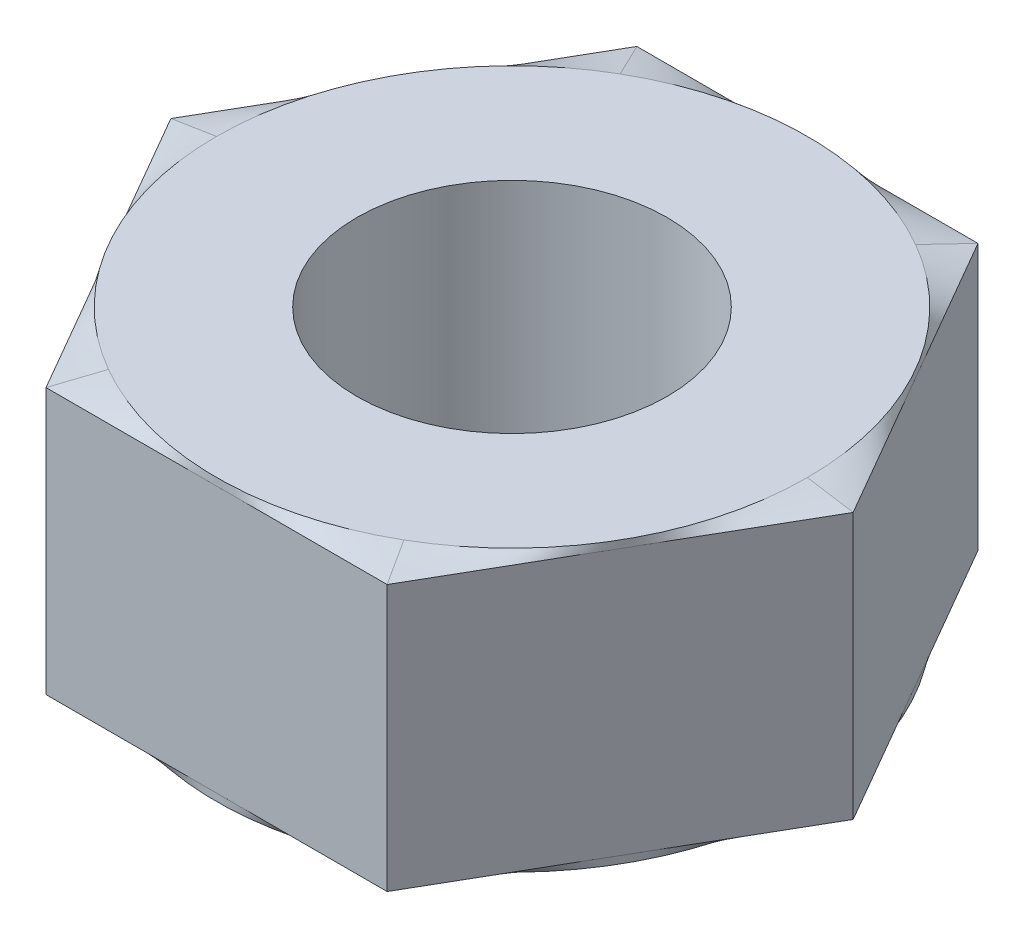
ISO-10303-21;
HEADER;
FILE_DESCRIPTION(('STEP AP214'),'2;1');
FILE_NAME('part.step','',(''),(''),'','','');
FILE_SCHEMA(('AUTOMOTIVE_DESIGN { 1 0 10303 214 1 1 1 1 }'));
ENDSEC;
DATA;
#1=APPLICATION_CONTEXT('core data for automotive mechanical design processes');
#2=APPLICATION_PROTOCOL_DEFINITION('international standard','automotive_design',2000,#1);
#3=PRODUCT_CONTEXT('',#1,'mechanical');
#4=PRODUCT('Part','Part','',(#3));
#5=PRODUCT_RELATED_PRODUCT_CATEGORY('part','',(#4));
#6=PRODUCT_DEFINITION_FORMATION('','',#4);
#7=PRODUCT_DEFINITION_CONTEXT('part definition',#1,'design');
#8=PRODUCT_DEFINITION('design','',#6,#7);
#9=PRODUCT_DEFINITION_SHAPE('','',#8);
#10=(LENGTH_UNIT() NAMED_UNIT(*) SI_UNIT(.MILLI.,.METRE.));
#11=(NAMED_UNIT(*) PLANE_ANGLE_UNIT() SI_UNIT($,.RADIAN.));
#12=(NAMED_UNIT(*) SI_UNIT($,.STERADIAN.) SOLID_ANGLE_UNIT());
#13=UNCERTAINTY_MEASURE_WITH_UNIT(LENGTH_MEASURE(1.E-05),#10,'distance_accuracy_value','');
#14=(GEOMETRIC_REPRESENTATION_CONTEXT(3) GLOBAL_UNCERTAINTY_ASSIGNED_CONTEXT((#13)) GLOBAL_UNIT_ASSIGNED_CONTEXT((#10,
#11,#12)) REPRESENTATION_CONTEXT('',''));
#15=CARTESIAN_POINT('',(0.,0.,0.));
#16=DIRECTION('',(0.,0.,1.));
#17=DIRECTION('',(1.,0.,0.));
#18=AXIS2_PLACEMENT_3D('',#15,#16,#17);
#19=CARTESIAN_POINT('',(2.3094010767585,1.8,4.));
#20=DIRECTION('',(-0.866025403784439,0.,-0.5));
#21=DIRECTION('',(-0.5,0.,0.866025403784439));
#22=AXIS2_PLACEMENT_3D('',#19,#20,#21);
#23=PLANE('',#22);
#24=DIRECTION('',(-0.5,0.,0.866025403784439));
#25=VECTOR('',#24,1.);
#26=CARTESIAN_POINT('',(2.3094010767585,0.,4.));
#27=LINE('',#26,#25);
#28=CARTESIAN_POINT('',(2.3094010767585,0.,4.));
#29=VERTEX_POINT('',#28);
#30=CARTESIAN_POINT('',(4.618802153517,0.,0.));
#31=VERTEX_POINT('',#30);
#32=EDGE_CURVE('E161',#29,#31,#27,.F.);
#33=ORIENTED_EDGE('',*,*,#32,.T.);
#34=DIRECTION('',(0.,-1.,0.));
#35=VECTOR('',#34,1.);
#36=CARTESIAN_POINT('',(4.618802153517,1.8,0.));
#37=LINE('',#36,#35);
#38=CARTESIAN_POINT('',(4.618802153517,3.6,0.));
#39=VERTEX_POINT('',#38);
#40=EDGE_CURVE('E12',#39,#31,#37,.T.);
#41=ORIENTED_EDGE('',*,*,#40,.F.);
#42=CARTESIAN_POINT('',(2.3094010767585,3.6,4.));
#43=CARTESIAN_POINT('',(2.50185116648838,3.6,3.66666666666666));
#44=CARTESIAN_POINT('',(2.69430125621826,3.6,3.33333333333333));
#45=CARTESIAN_POINT('',(3.07920143567801,3.6,2.66666666666666));
#46=CARTESIAN_POINT('',(3.27165152540788,3.6,2.33333333333333));
#47=CARTESIAN_POINT('',(3.65655170486763,3.6,1.66666666666666));
#48=CARTESIAN_POINT('',(3.84900179459751,3.6,1.33333333333333));
#49=CARTESIAN_POINT('',(4.23390197405726,3.6,0.666666666666661));
#50=CARTESIAN_POINT('',(4.42635206378713,3.6,0.33333333333333));
#51=CARTESIAN_POINT('',(4.618802153517,3.6,0.));
#52=B_SPLINE_CURVE_WITH_KNOTS('',3,(#42,#43,#44,#45,#46,#47,#48,#49,#50,#51),.UNSPECIFIED.,.F.,
.F.,(4,2,2,2,4),(0.,0.25,0.5,0.75,1.),.UNSPECIFIED.);
#53=CARTESIAN_POINT('',(2.3094010767585,3.6,4.));
#54=VERTEX_POINT('',#53);
#55=EDGE_CURVE('E238',#54,#39,#52,.T.);
#56=ORIENTED_EDGE('',*,*,#55,.F.);
#57=DIRECTION('',(0.,-1.,0.));
#58=VECTOR('',#57,1.);
#59=CARTESIAN_POINT('',(2.3094010767585,1.8,4.));
#60=LINE('',#59,#58);
#61=EDGE_CURVE('E521',#54,#29,#60,.T.);
#62=ORIENTED_EDGE('',*,*,#61,.T.);
#63=EDGE_LOOP('',(#33,#41,#56,#62));
#64=FACE_BOUND('',#63,.T.);
#65=ADVANCED_FACE('F123',(#64),#23,.F.);
#66=CARTESIAN_POINT('',(4.618802153517,1.8,0.));
#67=DIRECTION('',(-0.866025403784438,0.,0.5));
#68=DIRECTION('',(0.5,0.,0.866025403784439));
#69=AXIS2_PLACEMENT_3D('',#66,#67,#68);
#70=PLANE('',#69);
#71=DIRECTION('',(0.5,0.,0.866025403784439));
#72=VECTOR('',#71,1.);
#73=CARTESIAN_POINT('',(4.618802153517,0.,0.));
#74=LINE('',#73,#72);
#75=CARTESIAN_POINT('',(2.3094010767585,0.,-4.));
#76=VERTEX_POINT('',#75);
#77=EDGE_CURVE('E167',#31,#76,#74,.F.);
#78=ORIENTED_EDGE('',*,*,#77,.T.);
#79=DIRECTION('',(0.,-1.,0.));
#80=VECTOR('',#79,1.);
#81=CARTESIAN_POINT('',(2.3094010767585,1.8,-4.));
#82=LINE('',#81,#80);
#83=CARTESIAN_POINT('',(2.3094010767585,3.6,-4.));
#84=VERTEX_POINT('',#83);
#85=EDGE_CURVE('E133',#84,#76,#82,.T.);
#86=ORIENTED_EDGE('',*,*,#85,.F.);
#87=CARTESIAN_POINT('',(4.61880215351701,3.6,0.));
#88=CARTESIAN_POINT('',(4.52257710865207,3.6,-0.166666666666667));
#89=CARTESIAN_POINT('',(4.42635206378713,3.6,-0.333333333333333));
#90=CARTESIAN_POINT('',(4.23390197405726,3.6,-0.666666666666665));
#91=CARTESIAN_POINT('',(4.13767692919232,3.6,-0.833333333333331));
#92=CARTESIAN_POINT('',(3.94522683946244,3.6,-1.16666666666666));
#93=CARTESIAN_POINT('',(3.84900179459751,3.6,-1.33333333333333));
#94=CARTESIAN_POINT('',(3.65655170486763,3.6,-1.66666666666666));
#95=CARTESIAN_POINT('',(3.56032666000269,3.6,-1.83333333333333));
#96=CARTESIAN_POINT('',(3.36787657027282,3.6,-2.16666666666666));
#97=CARTESIAN_POINT('',(3.27165152540788,3.6,-2.33333333333333));
#98=CARTESIAN_POINT('',(3.079201435678,3.6,-2.66666666666666));
#99=CARTESIAN_POINT('',(2.98297639081307,3.6,-2.83333333333333));
#100=CARTESIAN_POINT('',(2.79052630108319,3.6,-3.16666666666666));
#101=CARTESIAN_POINT('',(2.69430125621825,3.6,-3.33333333333333));
#102=CARTESIAN_POINT('',(2.50185116648838,3.6,-3.66666666666667));
#103=CARTESIAN_POINT('',(2.40562612162344,3.6,-3.83333333333333));
#104=CARTESIAN_POINT('',(2.3094010767585,3.6,-4.));
#105=B_SPLINE_CURVE_WITH_KNOTS('',3,(#87,#88,#89,#90,#91,#92,#93,#94,#95,#96,#97,#98,#99,#100,
#101,#102,#103,#104),.UNSPECIFIED.,.F.,.F.,(4,2,2,2,2,2,2,2,4),(0.,0.577350269189624,
1.15470053837925,1.73205080756887,2.3094010767585,2.88675134594812,3.46410161513775,
4.04145188432738,4.61880215351701),.UNSPECIFIED.);
#106=EDGE_CURVE('E689',#39,#84,#105,.T.);
#107=ORIENTED_EDGE('',*,*,#106,.F.);
#108=ORIENTED_EDGE('',*,*,#40,.T.);
#109=EDGE_LOOP('',(#78,#86,#107,#108));
#110=FACE_BOUND('',#109,.T.);
#111=ADVANCED_FACE('F511',(#110),#70,.F.);
#112=CARTESIAN_POINT('',(2.3094010767585,1.8,-4.));
#113=DIRECTION('',(0.,0.,1.));
#114=DIRECTION('',(1.,0.,0.));
#115=AXIS2_PLACEMENT_3D('',#112,#113,#114);
#116=PLANE('',#115);
#117=DIRECTION('',(1.,0.,0.));
#118=VECTOR('',#117,1.);
#119=CARTESIAN_POINT('',(2.3094010767585,0.,-4.));
#120=LINE('',#119,#118);
#121=CARTESIAN_POINT('',(-2.3094010767585,0.,-4.));
#122=VERTEX_POINT('',#121);
#123=EDGE_CURVE('E142',#76,#122,#120,.F.);
#124=ORIENTED_EDGE('',*,*,#123,.T.);
#125=DIRECTION('',(0.,-1.,0.));
#126=VECTOR('',#125,1.);
#127=CARTESIAN_POINT('',(-2.3094010767585,1.8,-4.));
#128=LINE('',#127,#126);
#129=CARTESIAN_POINT('',(-2.3094010767585,3.6,-4.));
#130=VERTEX_POINT('',#129);
#131=EDGE_CURVE('E578',#130,#122,#128,.T.);
#132=ORIENTED_EDGE('',*,*,#131,.F.);
#133=CARTESIAN_POINT('',(2.3094010767585,3.6,-4.));
#134=CARTESIAN_POINT('',(2.11695098702863,3.6,-4.));
#135=CARTESIAN_POINT('',(1.92450089729875,3.6,-4.));
#136=CARTESIAN_POINT('',(1.539600717839,3.6,-4.));
#137=CARTESIAN_POINT('',(1.34715062810912,3.6,-4.));
#138=CARTESIAN_POINT('',(0.962250448649373,3.6,-4.));
#139=CARTESIAN_POINT('',(0.769800358919498,3.6,-4.));
#140=CARTESIAN_POINT('',(0.384900179459747,3.6,-4.));
#141=CARTESIAN_POINT('',(0.192450089729872,3.6,-4.));
#142=CARTESIAN_POINT('',(-0.192450089729879,3.6,-4.));
#143=CARTESIAN_POINT('',(-0.384900179459754,3.6,-4.));
#144=CARTESIAN_POINT('',(-0.769800358919504,3.6,-4.));
#145=CARTESIAN_POINT('',(-0.96225044864938,3.6,-4.));
#146=CARTESIAN_POINT('',(-1.34715062810913,3.6,-4.));
#147=CARTESIAN_POINT('',(-1.53960071783901,3.6,-4.));
#148=CARTESIAN_POINT('',(-1.92450089729876,3.6,-4.));
#149=CARTESIAN_POINT('',(-2.11695098702863,3.6,-4.));
#150=CARTESIAN_POINT('',(-2.30940107675851,3.6,-4.));
#151=B_SPLINE_CURVE_WITH_KNOTS('',3,(#133,#134,#135,#136,#137,#138,#139,#140,#141,#142,#143,
#144,#145,#146,#147,#148,#149,#150),.UNSPECIFIED.,.F.,.F.,(4,2,2,2,2,2,2,2,4),(0.,
0.577350269189627,1.15470053837925,1.73205080756888,2.3094010767585,2.88675134594813,
3.46410161513776,4.04145188432738,4.61880215351701),.UNSPECIFIED.);
#152=EDGE_CURVE('E599',#84,#130,#151,.T.);
#153=ORIENTED_EDGE('',*,*,#152,.F.);
#154=ORIENTED_EDGE('',*,*,#85,.T.);
#155=EDGE_LOOP('',(#124,#132,#153,#154));
#156=FACE_BOUND('',#155,.T.);
#157=ADVANCED_FACE('F516',(#156),#116,.F.);
#158=CARTESIAN_POINT('',(-2.3094010767585,1.8,-4.));
#159=DIRECTION('',(0.866025403784439,0.,0.5));
#160=DIRECTION('',(0.5,0.,-0.866025403784439));
#161=AXIS2_PLACEMENT_3D('',#158,#159,#160);
#162=PLANE('',#161);
#163=DIRECTION('',(0.5,0.,-0.866025403784439));
#164=VECTOR('',#163,1.);
#165=CARTESIAN_POINT('',(-2.3094010767585,0.,-4.));
#166=LINE('',#165,#164);
#167=CARTESIAN_POINT('',(-4.61880215351701,0.,0.));
#168=VERTEX_POINT('',#167);
#169=EDGE_CURVE('E637',#122,#168,#166,.F.);
#170=ORIENTED_EDGE('',*,*,#169,.T.);
#171=DIRECTION('',(0.,-1.,0.));
#172=VECTOR('',#171,1.);
#173=CARTESIAN_POINT('',(-4.61880215351701,1.8,0.));
#174=LINE('',#173,#172);
#175=CARTESIAN_POINT('',(-4.61880215351701,3.6,0.));
#176=VERTEX_POINT('',#175);
#177=EDGE_CURVE('E570',#176,#168,#174,.T.);
#178=ORIENTED_EDGE('',*,*,#177,.F.);
#179=CARTESIAN_POINT('',(-2.3094010767585,3.6,-4.));
#180=CARTESIAN_POINT('',(-2.40562612162344,3.6,-3.83333333333334));
#181=CARTESIAN_POINT('',(-2.50185116648838,3.6,-3.66666666666667));
#182=CARTESIAN_POINT('',(-2.69430125621825,3.6,-3.33333333333333));
#183=CARTESIAN_POINT('',(-2.79052630108319,3.6,-3.16666666666667));
#184=CARTESIAN_POINT('',(-2.98297639081307,3.6,-2.83333333333333));
#185=CARTESIAN_POINT('',(-3.07920143567801,3.6,-2.66666666666667));
#186=CARTESIAN_POINT('',(-3.27165152540788,3.6,-2.33333333333333));
#187=CARTESIAN_POINT('',(-3.36787657027282,3.6,-2.16666666666667));
#188=CARTESIAN_POINT('',(-3.56032666000269,3.6,-1.83333333333333));
#189=CARTESIAN_POINT('',(-3.65655170486763,3.6,-1.66666666666667));
#190=CARTESIAN_POINT('',(-3.84900179459751,3.6,-1.33333333333333));
#191=CARTESIAN_POINT('',(-3.94522683946244,3.6,-1.16666666666667));
#192=CARTESIAN_POINT('',(-4.13767692919232,3.6,-0.833333333333333));
#193=CARTESIAN_POINT('',(-4.23390197405726,3.6,-0.666666666666667));
#194=CARTESIAN_POINT('',(-4.42635206378713,3.6,-0.333333333333333));
#195=CARTESIAN_POINT('',(-4.52257710865207,3.6,-0.166666666666666));
#196=CARTESIAN_POINT('',(-4.61880215351701,3.6,0.));
#197=B_SPLINE_CURVE_WITH_KNOTS('',3,(#179,#180,#181,#182,#183,#184,#185,#186,#187,#188,#189,
#190,#191,#192,#193,#194,#195,#196),.UNSPECIFIED.,.F.,.F.,(4,2,2,2,2,2,2,2,4),(0.,
0.577350269189626,1.15470053837925,1.73205080756888,2.3094010767585,2.88675134594813,
3.46410161513776,4.04145188432738,4.61880215351701),.UNSPECIFIED.);
#198=EDGE_CURVE('E396',#130,#176,#197,.T.);
#199=ORIENTED_EDGE('',*,*,#198,.F.);
#200=ORIENTED_EDGE('',*,*,#131,.T.);
#201=EDGE_LOOP('',(#170,#178,#199,#200));
#202=FACE_BOUND('',#201,.T.);
#203=ADVANCED_FACE('F561',(#202),#162,.F.);
#204=CARTESIAN_POINT('',(-4.61880215351701,1.8,0.));
#205=DIRECTION('',(0.866025403784439,0.,-0.5));
#206=DIRECTION('',(-0.5,0.,-0.866025403784439));
#207=AXIS2_PLACEMENT_3D('',#204,#205,#206);
#208=PLANE('',#207);
#209=DIRECTION('',(-0.5,0.,-0.866025403784439));
#210=VECTOR('',#209,1.);
#211=CARTESIAN_POINT('',(-4.61880215351701,0.,0.));
#212=LINE('',#211,#210);
#213=CARTESIAN_POINT('',(-2.3094010767585,0.,4.));
#214=VERTEX_POINT('',#213);
#215=EDGE_CURVE('E635',#168,#214,#212,.F.);
#216=ORIENTED_EDGE('',*,*,#215,.T.);
#217=DIRECTION('',(0.,-1.,0.));
#218=VECTOR('',#217,1.);
#219=CARTESIAN_POINT('',(-2.3094010767585,1.8,4.));
#220=LINE('',#219,#218);
#221=CARTESIAN_POINT('',(-2.3094010767585,3.6,4.));
#222=VERTEX_POINT('',#221);
#223=EDGE_CURVE('E532',#222,#214,#220,.T.);
#224=ORIENTED_EDGE('',*,*,#223,.F.);
#225=CARTESIAN_POINT('',(-4.61880215351701,3.6,0.));
#226=CARTESIAN_POINT('',(-4.52257710865207,3.6,0.166666666666666));
#227=CARTESIAN_POINT('',(-4.42635206378713,3.6,0.333333333333333));
#228=CARTESIAN_POINT('',(-4.23390197405726,3.6,0.666666666666666));
#229=CARTESIAN_POINT('',(-4.13767692919232,3.6,0.833333333333333));
#230=CARTESIAN_POINT('',(-3.94522683946245,3.6,1.16666666666667));
#231=CARTESIAN_POINT('',(-3.84900179459751,3.6,1.33333333333333));
#232=CARTESIAN_POINT('',(-3.65655170486763,3.6,1.66666666666667));
#233=CARTESIAN_POINT('',(-3.56032666000269,3.6,1.83333333333333));
#234=CARTESIAN_POINT('',(-3.36787657027282,3.6,2.16666666666667));
#235=CARTESIAN_POINT('',(-3.27165152540788,3.6,2.33333333333333));
#236=CARTESIAN_POINT('',(-3.07920143567801,3.6,2.66666666666667));
#237=CARTESIAN_POINT('',(-2.98297639081307,3.6,2.83333333333333));
#238=CARTESIAN_POINT('',(-2.79052630108319,3.6,3.16666666666667));
#239=CARTESIAN_POINT('',(-2.69430125621825,3.6,3.33333333333333));
#240=CARTESIAN_POINT('',(-2.50185116648838,3.6,3.66666666666667));
#241=CARTESIAN_POINT('',(-2.40562612162344,3.6,3.83333333333334));
#242=CARTESIAN_POINT('',(-2.3094010767585,3.6,4.));
#243=B_SPLINE_CURVE_WITH_KNOTS('',3,(#225,#226,#227,#228,#229,#230,#231,#232,#233,#234,#235,
#236,#237,#238,#239,#240,#241,#242),.UNSPECIFIED.,.F.,.F.,(4,2,2,2,2,2,2,2,4),(0.,
0.577350269189626,1.15470053837925,1.73205080756888,2.3094010767585,2.88675134594813,
3.46410161513776,4.04145188432738,4.61880215351701),.UNSPECIFIED.);
#244=EDGE_CURVE('E407',#176,#222,#243,.T.);
#245=ORIENTED_EDGE('',*,*,#244,.F.);
#246=ORIENTED_EDGE('',*,*,#177,.T.);
#247=EDGE_LOOP('',(#216,#224,#245,#246));
#248=FACE_BOUND('',#247,.T.);
#249=ADVANCED_FACE('F553',(#248),#208,.F.);
#250=CARTESIAN_POINT('',(-2.3094010767585,1.8,4.));
#251=DIRECTION('',(0.,0.,-1.));
#252=DIRECTION('',(-1.,0.,0.));
#253=AXIS2_PLACEMENT_3D('',#250,#251,#252);
#254=PLANE('',#253);
#255=DIRECTION('',(-1.,0.,0.));
#256=VECTOR('',#255,1.);
#257=CARTESIAN_POINT('',(-2.3094010767585,0.,4.));
#258=LINE('',#257,#256);
#259=EDGE_CURVE('E529',#214,#29,#258,.F.);
#260=ORIENTED_EDGE('',*,*,#259,.T.);
#261=ORIENTED_EDGE('',*,*,#61,.F.);
#262=CARTESIAN_POINT('',(-2.3094010767585,3.6,4.));
#263=CARTESIAN_POINT('',(-2.11695098702863,3.6,4.));
#264=CARTESIAN_POINT('',(-1.92450089729875,3.6,4.));
#265=CARTESIAN_POINT('',(-1.539600717839,3.6,4.));
#266=CARTESIAN_POINT('',(-1.34715062810913,3.6,4.));
#267=CARTESIAN_POINT('',(-0.962250448649378,3.6,4.));
#268=CARTESIAN_POINT('',(-0.769800358919503,3.6,4.));
#269=CARTESIAN_POINT('',(-0.384900179459752,3.6,4.));
#270=CARTESIAN_POINT('',(-0.192450089729877,3.6,4.));
#271=CARTESIAN_POINT('',(0.192450089729873,3.6,4.));
#272=CARTESIAN_POINT('',(0.384900179459749,3.6,4.));
#273=CARTESIAN_POINT('',(0.769800358919499,3.6,4.));
#274=CARTESIAN_POINT('',(0.962250448649375,3.6,4.));
#275=CARTESIAN_POINT('',(1.34715062810913,3.6,4.));
#276=CARTESIAN_POINT('',(1.539600717839,3.6,4.));
#277=CARTESIAN_POINT('',(1.92450089729875,3.6,4.));
#278=CARTESIAN_POINT('',(2.11695098702863,3.6,4.));
#279=CARTESIAN_POINT('',(2.3094010767585,3.6,4.));
#280=B_SPLINE_CURVE_WITH_KNOTS('',3,(#262,#263,#264,#265,#266,#267,#268,#269,#270,#271,#272,
#273,#274,#275,#276,#277,#278,#279),.UNSPECIFIED.,.F.,.F.,(4,2,2,2,2,2,2,2,4),(0.,
0.577350269189625,1.15470053837925,1.73205080756888,2.3094010767585,2.88675134594813,
3.46410161513775,4.04145188432738,4.61880215351701),.UNSPECIFIED.);
#281=EDGE_CURVE('E418',#222,#54,#280,.T.);
#282=ORIENTED_EDGE('',*,*,#281,.F.);
#283=ORIENTED_EDGE('',*,*,#223,.T.);
#284=EDGE_LOOP('',(#260,#261,#282,#283));
#285=FACE_BOUND('',#284,.T.);
#286=ADVANCED_FACE('F543',(#285),#254,.F.);
#287=CARTESIAN_POINT('',(0.,-0.1,0.));
#288=DIRECTION('',(0.,-1.,0.));
#289=DIRECTION('',(0.,0.,-1.));
#290=AXIS2_PLACEMENT_3D('',#287,#288,#289);
#291=PLANE('',#290);
#292=CARTESIAN_POINT('',(0.,-0.1,0.));
#293=DIRECTION('',(0.,1.,0.));
#294=DIRECTION('',(0.,0.,1.));
#295=AXIS2_PLACEMENT_3D('',#292,#293,#294);
#296=CIRCLE('',#295,2.1);
#297=CARTESIAN_POINT('',(0.,-0.1,2.1));
#298=VERTEX_POINT('',#297);
#299=EDGE_CURVE('E322',#298,#298,#296,.T.);
#300=ORIENTED_EDGE('',*,*,#299,.T.);
#301=EDGE_LOOP('',(#300));
#302=FACE_BOUND('',#301,.T.);
#303=CARTESIAN_POINT('',(0.,-0.1,0.));
#304=DIRECTION('',(0.,-1.,0.));
#305=DIRECTION('',(0.,0.,-1.));
#306=AXIS2_PLACEMENT_3D('',#303,#304,#305);
#307=CIRCLE('',#306,4.);
#308=CARTESIAN_POINT('',(4.,-0.1,0.));
#309=VERTEX_POINT('',#308);
#310=CARTESIAN_POINT('',(2.,-0.1,3.46410161513776));
#311=VERTEX_POINT('',#310);
#312=EDGE_CURVE('E174',#309,#311,#307,.T.);
#313=ORIENTED_EDGE('',*,*,#312,.T.);
#314=CARTESIAN_POINT('',(-2.,-0.1,3.46410161513776));
#315=VERTEX_POINT('',#314);
#316=EDGE_CURVE('E179',#311,#315,#307,.T.);
#317=ORIENTED_EDGE('',*,*,#316,.T.);
#318=CARTESIAN_POINT('',(-4.,-0.1,0.));
#319=VERTEX_POINT('',#318);
#320=EDGE_CURVE('E678',#315,#319,#307,.T.);
#321=ORIENTED_EDGE('',*,*,#320,.T.);
#322=CARTESIAN_POINT('',(-2.,-0.1,-3.46410161513776));
#323=VERTEX_POINT('',#322);
#324=EDGE_CURVE('E656',#319,#323,#307,.T.);
#325=ORIENTED_EDGE('',*,*,#324,.T.);
#326=CARTESIAN_POINT('',(2.,-0.1,-3.46410161513776));
#327=VERTEX_POINT('',#326);
#328=EDGE_CURVE('E653',#323,#327,#307,.T.);
#329=ORIENTED_EDGE('',*,*,#328,.T.);
#330=EDGE_CURVE('E652',#327,#309,#307,.T.);
#331=ORIENTED_EDGE('',*,*,#330,.T.);
#332=EDGE_LOOP('',(#313,#317,#321,#325,#329,#331));
#333=FACE_BOUND('',#332,.T.);
#334=ADVANCED_FACE('F452',(#302,#333),#291,.T.);
#335=CARTESIAN_POINT('',(-2.,-0.1,-3.46410161513776));
#336=CARTESIAN_POINT('',(-2.3094010767585,0.,-4.));
#337=CARTESIAN_POINT('',(-2.28867513459481,-0.1,-3.29743494847109));
#338=CARTESIAN_POINT('',(-2.50185116648838,0.,-3.66666666666667));
#339=CARTESIAN_POINT('',(-2.56618919069857,-0.1,-3.08834100997488));
#340=CARTESIAN_POINT('',(-2.69430125621825,0.,-3.33333333333333));
#341=CARTESIAN_POINT('',(-3.06479008625264,-0.1,-2.59427039522837));
#342=CARTESIAN_POINT('',(-3.07920143567801,0.,-2.66666666666667));
#343=CARTESIAN_POINT('',(-3.28546882018367,-0.1,-2.3094010767585));
#344=CARTESIAN_POINT('',(-3.27165152540788,0.,-2.33333333333333));
#345=CARTESIAN_POINT('',(-3.64273441009184,-0.1,-1.6905989232415));
#346=CARTESIAN_POINT('',(-3.65655170486763,0.,-1.66666666666667));
#347=CARTESIAN_POINT('',(-3.77909910967998,-0.1,-1.35705087434731));
#348=CARTESIAN_POINT('',(-3.84900179459751,0.,-1.33333333333333));
#349=CARTESIAN_POINT('',(-3.95767636553682,-0.1,-0.678214525074557));
#350=CARTESIAN_POINT('',(-4.23390197405726,0.,-0.666666666666666));
#351=CARTESIAN_POINT('',(-4.,-0.1,-0.333333333333333));
#352=CARTESIAN_POINT('',(-4.42635206378713,0.,-0.333333333333333));
#353=CARTESIAN_POINT('',(-4.,-0.1,0.));
#354=CARTESIAN_POINT('',(-4.61880215351701,0.,0.));
#355=B_SPLINE_SURFACE_WITH_KNOTS('',3,1,((#335,#336),(#337,#338),(#339,#340),(#341,#342),(#343,
#344),(#345,#346),(#347,#348),(#349,#350),(#351,#352),(#353,#354)),.UNSPECIFIED.,.F.,.F.,.F.,(4,
2,2,2,4),(2,2),(0.,0.25,0.5,0.75,1.),(0.,1.),.UNSPECIFIED.);
#356=DIRECTION('',(-0.987192622714516,0.159532835673524,0.));
#357=VECTOR('',#356,1.);
#358=CARTESIAN_POINT('',(-4.3094010767585,-0.05,0.));
#359=LINE('',#358,#357);
#360=EDGE_CURVE('E738',#319,#168,#359,.T.);
#361=DIRECTION('',(0.49359631135726,-0.159532835673524,0.854933889699356));
#362=VECTOR('',#361,1.);
#363=CARTESIAN_POINT('',(-2.15470053837925,-0.05,-3.73205080756888));
#364=LINE('',#363,#362);
#365=EDGE_CURVE('E743',#122,#323,#364,.T.);
#366=ORIENTED_EDGE('',*,*,#324,.F.);
#367=ORIENTED_EDGE('',*,*,#360,.T.);
#368=ORIENTED_EDGE('',*,*,#169,.F.);
#369=ORIENTED_EDGE('',*,*,#365,.T.);
#370=EDGE_LOOP('',(#366,#367,#368,#369));
#371=FACE_BOUND('',#370,.T.);
#372=ADVANCED_FACE('F701',(#371),#355,.T.);
#373=CARTESIAN_POINT('',(-4.,-0.1,0.));
#374=CARTESIAN_POINT('',(-4.61880215351701,0.,0.));
#375=CARTESIAN_POINT('',(-4.,-0.1,0.333333333333334));
#376=CARTESIAN_POINT('',(-4.42635206378713,0.,0.333333333333333));
#377=CARTESIAN_POINT('',(-3.95767636553682,-0.1,0.678214525074558));
#378=CARTESIAN_POINT('',(-4.23390197405726,0.,0.666666666666666));
#379=CARTESIAN_POINT('',(-3.77909910967998,-0.1,1.35705087434731));
#380=CARTESIAN_POINT('',(-3.84900179459751,0.,1.33333333333333));
#381=CARTESIAN_POINT('',(-3.64273441009184,-0.1,1.6905989232415));
#382=CARTESIAN_POINT('',(-3.65655170486763,0.,1.66666666666667));
#383=CARTESIAN_POINT('',(-3.28546882018367,-0.1,2.30940107675851));
#384=CARTESIAN_POINT('',(-3.27165152540788,0.,2.33333333333333));
#385=CARTESIAN_POINT('',(-3.06479008625264,-0.1,2.59427039522837));
#386=CARTESIAN_POINT('',(-3.07920143567801,0.,2.66666666666667));
#387=CARTESIAN_POINT('',(-2.56618919069857,-0.1,3.08834100997488));
#388=CARTESIAN_POINT('',(-2.69430125621825,0.,3.33333333333333));
#389=CARTESIAN_POINT('',(-2.28867513459481,-0.1,3.29743494847109));
#390=CARTESIAN_POINT('',(-2.50185116648838,0.,3.66666666666667));
#391=CARTESIAN_POINT('',(-2.,-0.1,3.46410161513776));
#392=CARTESIAN_POINT('',(-2.3094010767585,0.,4.));
#393=B_SPLINE_SURFACE_WITH_KNOTS('',3,1,((#373,#374),(#375,#376),(#377,#378),(#379,#380),(#381,
#382),(#383,#384),(#385,#386),(#387,#388),(#389,#390),(#391,#392)),.UNSPECIFIED.,.F.,.F.,.F.,(4,
2,2,2,4),(2,2),(0.,0.25,0.5,0.75,1.),(0.,1.),.UNSPECIFIED.);
#394=DIRECTION('',(-0.49359631135726,0.159532835673524,0.854933889699356));
#395=VECTOR('',#394,1.);
#396=CARTESIAN_POINT('',(-2.15470053837925,-0.05,3.73205080756888));
#397=LINE('',#396,#395);
#398=EDGE_CURVE('E736',#315,#214,#397,.T.);
#399=ORIENTED_EDGE('',*,*,#320,.F.);
#400=ORIENTED_EDGE('',*,*,#398,.T.);
#401=ORIENTED_EDGE('',*,*,#215,.F.);
#402=ORIENTED_EDGE('',*,*,#360,.F.);
#403=EDGE_LOOP('',(#399,#400,#401,#402));
#404=FACE_BOUND('',#403,.T.);
#405=ADVANCED_FACE('F693',(#404),#393,.T.);
#406=CARTESIAN_POINT('',(2.,-0.1,-3.46410161513776));
#407=CARTESIAN_POINT('',(2.3094010767585,0.,-4.));
#408=CARTESIAN_POINT('',(1.71132486540519,-0.1,-3.63076828180442));
#409=CARTESIAN_POINT('',(1.92450089729875,0.,-4.));
#410=CARTESIAN_POINT('',(1.39148717483824,-0.1,-3.76655553504943));
#411=CARTESIAN_POINT('',(1.539600717839,0.,-4.));
#412=CARTESIAN_POINT('',(0.714309023427341,-0.1,-3.95132126957567));
#413=CARTESIAN_POINT('',(0.769800358919496,0.,-4.));
#414=CARTESIAN_POINT('',(0.357265589908163,-0.1,-4.));
#415=CARTESIAN_POINT('',(0.384900179459746,0.,-4.));
#416=CARTESIAN_POINT('',(-0.357265589908164,-0.1,-4.));
#417=CARTESIAN_POINT('',(-0.384900179459754,0.,-4.));
#418=CARTESIAN_POINT('',(-0.714309023427341,-0.1,-3.95132126957567));
#419=CARTESIAN_POINT('',(-0.769800358919504,0.,-4.));
#420=CARTESIAN_POINT('',(-1.39148717483824,-0.1,-3.76655553504943));
#421=CARTESIAN_POINT('',(-1.539600717839,0.,-4.));
#422=CARTESIAN_POINT('',(-1.71132486540519,-0.1,-3.63076828180442));
#423=CARTESIAN_POINT('',(-1.92450089729875,0.,-4.));
#424=CARTESIAN_POINT('',(-2.,-0.1,-3.46410161513776));
#425=CARTESIAN_POINT('',(-2.3094010767585,0.,-4.));
#426=B_SPLINE_SURFACE_WITH_KNOTS('',3,1,((#406,#407),(#408,#409),(#410,#411),(#412,#413),(#414,
#415),(#416,#417),(#418,#419),(#420,#421),(#422,#423),(#424,#425)),.UNSPECIFIED.,.F.,.F.,.F.,(4,
2,2,2,4),(2,2),(0.,0.25,0.5,0.75,1.),(0.,1.),.UNSPECIFIED.);
#427=DIRECTION('',(0.493596311357257,0.159532835673525,-0.854933889699358));
#428=VECTOR('',#427,1.);
#429=CARTESIAN_POINT('',(2.15470053837925,-0.05,-3.73205080756888));
#430=LINE('',#429,#428);
#431=EDGE_CURVE('E522',#327,#76,#430,.T.);
#432=ORIENTED_EDGE('',*,*,#328,.F.);
#433=ORIENTED_EDGE('',*,*,#365,.F.);
#434=ORIENTED_EDGE('',*,*,#123,.F.);
#435=ORIENTED_EDGE('',*,*,#431,.F.);
#436=EDGE_LOOP('',(#432,#433,#434,#435));
#437=FACE_BOUND('',#436,.T.);
#438=ADVANCED_FACE('F690',(#437),#426,.T.);
#439=CARTESIAN_POINT('',(-2.,-0.1,3.46410161513776));
#440=CARTESIAN_POINT('',(-2.3094010767585,0.,4.));
#441=CARTESIAN_POINT('',(-1.71132486540519,-0.1,3.63076828180442));
#442=CARTESIAN_POINT('',(-1.92450089729875,0.,4.));
#443=CARTESIAN_POINT('',(-1.39148717483824,-0.1,3.76655553504943));
#444=CARTESIAN_POINT('',(-1.539600717839,0.,4.));
#445=CARTESIAN_POINT('',(-0.714309023427341,-0.1,3.95132126957567));
#446=CARTESIAN_POINT('',(-0.769800358919503,0.,4.));
#447=CARTESIAN_POINT('',(-0.357265589908163,-0.1,4.));
#448=CARTESIAN_POINT('',(-0.384900179459752,0.,4.));
#449=CARTESIAN_POINT('',(0.357265589908164,-0.1,4.));
#450=CARTESIAN_POINT('',(0.384900179459749,0.,4.));
#451=CARTESIAN_POINT('',(0.714309023427341,-0.1,3.95132126957567));
#452=CARTESIAN_POINT('',(0.7698003589195,0.,4.));
#453=CARTESIAN_POINT('',(1.39148717483825,-0.1,3.76655553504943));
#454=CARTESIAN_POINT('',(1.539600717839,0.,4.));
#455=CARTESIAN_POINT('',(1.71132486540519,-0.1,3.63076828180442));
#456=CARTESIAN_POINT('',(1.92450089729875,0.,4.));
#457=CARTESIAN_POINT('',(2.,-0.1,3.46410161513776));
#458=CARTESIAN_POINT('',(2.3094010767585,0.,4.));
#459=B_SPLINE_SURFACE_WITH_KNOTS('',3,1,((#439,#440),(#441,#442),(#443,#444),(#445,#446),(#447,
#448),(#449,#450),(#451,#452),(#453,#454),(#455,#456),(#457,#458)),.UNSPECIFIED.,.F.,.F.,.F.,(4,
2,2,2,4),(2,2),(0.,0.25,0.5,0.75,1.),(0.,1.),.UNSPECIFIED.);
#460=DIRECTION('',(0.493596311357257,0.159532835673524,0.854933889699358));
#461=VECTOR('',#460,1.);
#462=CARTESIAN_POINT('',(2.15470053837925,-0.05,3.73205080756888));
#463=LINE('',#462,#461);
#464=EDGE_CURVE('E740',#311,#29,#463,.T.);
#465=ORIENTED_EDGE('',*,*,#316,.F.);
#466=ORIENTED_EDGE('',*,*,#464,.T.);
#467=ORIENTED_EDGE('',*,*,#259,.F.);
#468=ORIENTED_EDGE('',*,*,#398,.F.);
#469=EDGE_LOOP('',(#465,#466,#467,#468));
#470=FACE_BOUND('',#469,.T.);
#471=ADVANCED_FACE('F692',(#470),#459,.T.);
#472=CARTESIAN_POINT('',(2.,-0.1,3.46410161513776));
#473=CARTESIAN_POINT('',(2.3094010767585,0.,4.));
#474=CARTESIAN_POINT('',(2.28867513459481,-0.1,3.29743494847109));
#475=CARTESIAN_POINT('',(2.50185116648838,0.,3.66666666666666));
#476=CARTESIAN_POINT('',(2.56618919069857,-0.1,3.08834100997488));
#477=CARTESIAN_POINT('',(2.69430125621826,0.,3.33333333333333));
#478=CARTESIAN_POINT('',(3.06479008625264,-0.1,2.59427039522837));
#479=CARTESIAN_POINT('',(3.07920143567801,0.,2.66666666666666));
#480=CARTESIAN_POINT('',(3.28546882018367,-0.1,2.3094010767585));
#481=CARTESIAN_POINT('',(3.27165152540788,0.,2.33333333333333));
#482=CARTESIAN_POINT('',(3.64273441009184,-0.1,1.6905989232415));
#483=CARTESIAN_POINT('',(3.65655170486763,0.,1.66666666666666));
#484=CARTESIAN_POINT('',(3.77909910967998,-0.1,1.35705087434731));
#485=CARTESIAN_POINT('',(3.84900179459751,0.,1.33333333333333));
#486=CARTESIAN_POINT('',(3.95767636553682,-0.1,0.678214525074556));
#487=CARTESIAN_POINT('',(4.23390197405726,0.,0.666666666666661));
#488=CARTESIAN_POINT('',(4.,-0.1,0.333333333333332));
#489=CARTESIAN_POINT('',(4.42635206378713,0.,0.33333333333333));
#490=CARTESIAN_POINT('',(4.,-0.1,0.));
#491=CARTESIAN_POINT('',(4.618802153517,0.,0.));
#492=B_SPLINE_SURFACE_WITH_KNOTS('',3,1,((#472,#473),(#474,#475),(#476,#477),(#478,#479),(#480,
#481),(#482,#483),(#484,#485),(#486,#487),(#488,#489),(#490,#491)),.UNSPECIFIED.,.F.,.F.,.F.,(4,
2,2,2,4),(2,2),(0.,0.25,0.5,0.75,1.),(0.,1.),.UNSPECIFIED.);
#493=DIRECTION('',(0.987192622714516,0.159532835673525,0.));
#494=VECTOR('',#493,1.);
#495=CARTESIAN_POINT('',(4.3094010767585,-0.05,0.));
#496=LINE('',#495,#494);
#497=EDGE_CURVE('E525',#309,#31,#496,.T.);
#498=ORIENTED_EDGE('',*,*,#312,.F.);
#499=ORIENTED_EDGE('',*,*,#497,.T.);
#500=ORIENTED_EDGE('',*,*,#32,.F.);
#501=ORIENTED_EDGE('',*,*,#464,.F.);
#502=EDGE_LOOP('',(#498,#499,#500,#501));
#503=FACE_BOUND('',#502,.T.);
#504=ADVANCED_FACE('F699',(#503),#492,.T.);
#505=CARTESIAN_POINT('',(4.,-0.1,0.));
#506=CARTESIAN_POINT('',(4.618802153517,0.,0.));
#507=CARTESIAN_POINT('',(4.,-0.1,-0.333333333333335));
#508=CARTESIAN_POINT('',(4.42635206378713,0.,-0.333333333333333));
#509=CARTESIAN_POINT('',(3.95767636553682,-0.1,-0.678214525074558));
#510=CARTESIAN_POINT('',(4.23390197405725,0.,-0.666666666666665));
#511=CARTESIAN_POINT('',(3.77909910967998,-0.1,-1.35705087434731));
#512=CARTESIAN_POINT('',(3.84900179459751,0.,-1.33333333333333));
#513=CARTESIAN_POINT('',(3.64273441009184,-0.1,-1.6905989232415));
#514=CARTESIAN_POINT('',(3.65655170486763,0.,-1.66666666666666));
#515=CARTESIAN_POINT('',(3.28546882018367,-0.1,-2.3094010767585));
#516=CARTESIAN_POINT('',(3.27165152540788,0.,-2.33333333333333));
#517=CARTESIAN_POINT('',(3.06479008625264,-0.1,-2.59427039522837));
#518=CARTESIAN_POINT('',(3.079201435678,0.,-2.66666666666666));
#519=CARTESIAN_POINT('',(2.56618919069857,-0.1,-3.08834100997488));
#520=CARTESIAN_POINT('',(2.69430125621825,0.,-3.33333333333333));
#521=CARTESIAN_POINT('',(2.28867513459481,-0.1,-3.29743494847109));
#522=CARTESIAN_POINT('',(2.50185116648838,0.,-3.66666666666667));
#523=CARTESIAN_POINT('',(2.,-0.1,-3.46410161513776));
#524=CARTESIAN_POINT('',(2.3094010767585,0.,-4.));
#525=B_SPLINE_SURFACE_WITH_KNOTS('',3,1,((#505,#506),(#507,#508),(#509,#510),(#511,#512),(#513,
#514),(#515,#516),(#517,#518),(#519,#520),(#521,#522),(#523,#524)),.UNSPECIFIED.,.F.,.F.,.F.,(4,
2,2,2,4),(2,2),(0.,0.25,0.5,0.75,1.),(0.,1.),.UNSPECIFIED.);
#526=ORIENTED_EDGE('',*,*,#330,.F.);
#527=ORIENTED_EDGE('',*,*,#431,.T.);
#528=ORIENTED_EDGE('',*,*,#77,.F.);
#529=ORIENTED_EDGE('',*,*,#497,.F.);
#530=EDGE_LOOP('',(#526,#527,#528,#529));
#531=FACE_BOUND('',#530,.T.);
#532=ADVANCED_FACE('F282',(#531),#525,.T.);
#533=CARTESIAN_POINT('',(0.,3.7,0.));
#534=DIRECTION('',(0.,1.,0.));
#535=DIRECTION('',(0.,0.,-1.));
#536=AXIS2_PLACEMENT_3D('',#533,#534,#535);
#537=PLANE('',#536);
#538=CARTESIAN_POINT('',(0.,3.7,0.));
#539=DIRECTION('',(0.,1.,0.));
#540=DIRECTION('',(0.,0.,1.));
#541=AXIS2_PLACEMENT_3D('',#538,#539,#540);
#542=CIRCLE('',#541,2.1);
#543=CARTESIAN_POINT('',(0.,3.7,2.1));
#544=VERTEX_POINT('',#543);
#545=EDGE_CURVE('E127',#544,#544,#542,.F.);
#546=ORIENTED_EDGE('',*,*,#545,.T.);
#547=EDGE_LOOP('',(#546));
#548=FACE_BOUND('',#547,.T.);
#549=CARTESIAN_POINT('',(0.,3.7,0.));
#550=DIRECTION('',(0.,-1.,0.));
#551=DIRECTION('',(0.,0.,-1.));
#552=AXIS2_PLACEMENT_3D('',#549,#550,#551);
#553=CIRCLE('',#552,4.);
#554=CARTESIAN_POINT('',(4.,3.7,0.));
#555=VERTEX_POINT('',#554);
#556=CARTESIAN_POINT('',(2.,3.7,3.46410161513776));
#557=VERTEX_POINT('',#556);
#558=EDGE_CURVE('E236',#555,#557,#553,.T.);
#559=ORIENTED_EDGE('',*,*,#558,.F.);
#560=CARTESIAN_POINT('',(2.,3.7,-3.46410161513776));
#561=VERTEX_POINT('',#560);
#562=EDGE_CURVE('E246',#561,#555,#553,.T.);
#563=ORIENTED_EDGE('',*,*,#562,.F.);
#564=CARTESIAN_POINT('',(-2.,3.7,-3.46410161513776));
#565=VERTEX_POINT('',#564);
#566=EDGE_CURVE('E254',#565,#561,#553,.T.);
#567=ORIENTED_EDGE('',*,*,#566,.F.);
#568=CARTESIAN_POINT('',(-4.,3.7,0.));
#569=VERTEX_POINT('',#568);
#570=EDGE_CURVE('E319',#569,#565,#553,.T.);
#571=ORIENTED_EDGE('',*,*,#570,.F.);
#572=CARTESIAN_POINT('',(-2.,3.7,3.46410161513776));
#573=VERTEX_POINT('',#572);
#574=EDGE_CURVE('E328',#573,#569,#553,.T.);
#575=ORIENTED_EDGE('',*,*,#574,.F.);
#576=EDGE_CURVE('E263',#557,#573,#553,.T.);
#577=ORIENTED_EDGE('',*,*,#576,.F.);
#578=EDGE_LOOP('',(#559,#563,#567,#571,#575,#577));
#579=FACE_BOUND('',#578,.T.);
#580=ADVANCED_FACE('F260',(#548,#579),#537,.T.);
#581=CARTESIAN_POINT('',(-2.,3.7,-3.46410161513776));
#582=CARTESIAN_POINT('',(-2.3094010767585,3.6,-4.));
#583=CARTESIAN_POINT('',(-2.28867513459481,3.7,-3.29743494847109));
#584=CARTESIAN_POINT('',(-2.50185116648838,3.6,-3.66666666666667));
#585=CARTESIAN_POINT('',(-2.56618919069857,3.7,-3.08834100997488));
#586=CARTESIAN_POINT('',(-2.69430125621825,3.6,-3.33333333333333));
#587=CARTESIAN_POINT('',(-3.06479008625264,3.7,-2.59427039522837));
#588=CARTESIAN_POINT('',(-3.07920143567801,3.6,-2.66666666666667));
#589=CARTESIAN_POINT('',(-3.28546882018367,3.7,-2.3094010767585));
#590=CARTESIAN_POINT('',(-3.27165152540788,3.6,-2.33333333333333));
#591=CARTESIAN_POINT('',(-3.64273441009184,3.7,-1.6905989232415));
#592=CARTESIAN_POINT('',(-3.65655170486763,3.6,-1.66666666666667));
#593=CARTESIAN_POINT('',(-3.77909910967998,3.7,-1.35705087434731));
#594=CARTESIAN_POINT('',(-3.84900179459751,3.6,-1.33333333333333));
#595=CARTESIAN_POINT('',(-3.95767636553682,3.7,-0.678214525074557));
#596=CARTESIAN_POINT('',(-4.23390197405726,3.6,-0.666666666666666));
#597=CARTESIAN_POINT('',(-4.,3.7,-0.333333333333333));
#598=CARTESIAN_POINT('',(-4.42635206378713,3.6,-0.333333333333333));
#599=CARTESIAN_POINT('',(-4.,3.7,0.));
#600=CARTESIAN_POINT('',(-4.61880215351701,3.6,0.));
#601=B_SPLINE_SURFACE_WITH_KNOTS('',3,1,((#581,#582),(#583,#584),(#585,#586),(#587,#588),(#589,
#590),(#591,#592),(#593,#594),(#595,#596),(#597,#598),(#599,#600)),.UNSPECIFIED.,.F.,.F.,.F.,(4,
2,2,2,4),(2,2),(0.,0.25,0.5,0.75,1.),(0.,1.),.UNSPECIFIED.);
#602=DIRECTION('',(0.49359631135726,0.159532835673524,0.854933889699356));
#603=VECTOR('',#602,1.);
#604=CARTESIAN_POINT('',(-2.15470053837925,3.65,-3.73205080756888));
#605=LINE('',#604,#603);
#606=EDGE_CURVE('E265',#130,#565,#605,.T.);
#607=DIRECTION('',(-0.987192622714516,-0.159532835673524,0.));
#608=VECTOR('',#607,1.);
#609=CARTESIAN_POINT('',(-4.3094010767585,3.65,0.));
#610=LINE('',#609,#608);
#611=EDGE_CURVE('E490',#569,#176,#610,.T.);
#612=ORIENTED_EDGE('',*,*,#570,.T.);
#613=ORIENTED_EDGE('',*,*,#606,.F.);
#614=ORIENTED_EDGE('',*,*,#198,.T.);
#615=ORIENTED_EDGE('',*,*,#611,.F.);
#616=EDGE_LOOP('',(#612,#613,#614,#615));
#617=FACE_BOUND('',#616,.T.);
#618=ADVANCED_FACE('F281',(#617),#601,.F.);
#619=CARTESIAN_POINT('',(-4.,3.7,0.));
#620=CARTESIAN_POINT('',(-4.61880215351701,3.6,0.));
#621=CARTESIAN_POINT('',(-4.,3.7,0.333333333333334));
#622=CARTESIAN_POINT('',(-4.42635206378713,3.6,0.333333333333333));
#623=CARTESIAN_POINT('',(-3.95767636553682,3.7,0.678214525074558));
#624=CARTESIAN_POINT('',(-4.23390197405726,3.6,0.666666666666666));
#625=CARTESIAN_POINT('',(-3.77909910967998,3.7,1.35705087434731));
#626=CARTESIAN_POINT('',(-3.84900179459751,3.6,1.33333333333333));
#627=CARTESIAN_POINT('',(-3.64273441009184,3.7,1.6905989232415));
#628=CARTESIAN_POINT('',(-3.65655170486763,3.6,1.66666666666667));
#629=CARTESIAN_POINT('',(-3.28546882018367,3.7,2.30940107675851));
#630=CARTESIAN_POINT('',(-3.27165152540788,3.6,2.33333333333333));
#631=CARTESIAN_POINT('',(-3.06479008625264,3.7,2.59427039522837));
#632=CARTESIAN_POINT('',(-3.07920143567801,3.6,2.66666666666667));
#633=CARTESIAN_POINT('',(-2.56618919069857,3.7,3.08834100997488));
#634=CARTESIAN_POINT('',(-2.69430125621825,3.6,3.33333333333333));
#635=CARTESIAN_POINT('',(-2.28867513459481,3.7,3.29743494847109));
#636=CARTESIAN_POINT('',(-2.50185116648838,3.6,3.66666666666667));
#637=CARTESIAN_POINT('',(-2.,3.7,3.46410161513776));
#638=CARTESIAN_POINT('',(-2.3094010767585,3.6,4.));
#639=B_SPLINE_SURFACE_WITH_KNOTS('',3,1,((#619,#620),(#621,#622),(#623,#624),(#625,#626),(#627,
#628),(#629,#630),(#631,#632),(#633,#634),(#635,#636),(#637,#638)),.UNSPECIFIED.,.F.,.F.,.F.,(4,
2,2,2,4),(2,2),(0.,0.25,0.5,0.75,1.),(0.,1.),.UNSPECIFIED.);
#640=DIRECTION('',(-0.49359631135726,-0.159532835673524,0.854933889699356));
#641=VECTOR('',#640,1.);
#642=CARTESIAN_POINT('',(-2.15470053837925,3.65,3.73205080756888));
#643=LINE('',#642,#641);
#644=EDGE_CURVE('E343',#573,#222,#643,.T.);
#645=ORIENTED_EDGE('',*,*,#574,.T.);
#646=ORIENTED_EDGE('',*,*,#611,.T.);
#647=ORIENTED_EDGE('',*,*,#244,.T.);
#648=ORIENTED_EDGE('',*,*,#644,.F.);
#649=EDGE_LOOP('',(#645,#646,#647,#648));
#650=FACE_BOUND('',#649,.T.);
#651=ADVANCED_FACE('F369',(#650),#639,.F.);
#652=CARTESIAN_POINT('',(2.,3.7,-3.46410161513776));
#653=CARTESIAN_POINT('',(2.3094010767585,3.6,-4.));
#654=CARTESIAN_POINT('',(1.71132486540519,3.7,-3.63076828180442));
#655=CARTESIAN_POINT('',(1.92450089729875,3.6,-4.));
#656=CARTESIAN_POINT('',(1.39148717483824,3.7,-3.76655553504943));
#657=CARTESIAN_POINT('',(1.539600717839,3.6,-4.));
#658=CARTESIAN_POINT('',(0.714309023427341,3.7,-3.95132126957567));
#659=CARTESIAN_POINT('',(0.769800358919496,3.6,-4.));
#660=CARTESIAN_POINT('',(0.357265589908163,3.7,-4.));
#661=CARTESIAN_POINT('',(0.384900179459746,3.6,-4.));
#662=CARTESIAN_POINT('',(-0.357265589908164,3.7,-4.));
#663=CARTESIAN_POINT('',(-0.384900179459754,3.6,-4.));
#664=CARTESIAN_POINT('',(-0.714309023427341,3.7,-3.95132126957567));
#665=CARTESIAN_POINT('',(-0.769800358919504,3.6,-4.));
#666=CARTESIAN_POINT('',(-1.39148717483824,3.7,-3.76655553504943));
#667=CARTESIAN_POINT('',(-1.539600717839,3.6,-4.));
#668=CARTESIAN_POINT('',(-1.71132486540519,3.7,-3.63076828180442));
#669=CARTESIAN_POINT('',(-1.92450089729875,3.6,-4.));
#670=CARTESIAN_POINT('',(-2.,3.7,-3.46410161513776));
#671=CARTESIAN_POINT('',(-2.3094010767585,3.6,-4.));
#672=B_SPLINE_SURFACE_WITH_KNOTS('',3,1,((#652,#653),(#654,#655),(#656,#657),(#658,#659),(#660,
#661),(#662,#663),(#664,#665),(#666,#667),(#668,#669),(#670,#671)),.UNSPECIFIED.,.F.,.F.,.F.,(4,
2,2,2,4),(2,2),(0.,0.25,0.5,0.75,1.),(0.,1.),.UNSPECIFIED.);
#673=DIRECTION('',(0.493596311357257,-0.159532835673525,-0.854933889699358));
#674=VECTOR('',#673,1.);
#675=CARTESIAN_POINT('',(2.15470053837925,3.65,-3.73205080756888));
#676=LINE('',#675,#674);
#677=EDGE_CURVE('E242',#561,#84,#676,.T.);
#678=ORIENTED_EDGE('',*,*,#566,.T.);
#679=ORIENTED_EDGE('',*,*,#677,.T.);
#680=ORIENTED_EDGE('',*,*,#152,.T.);
#681=ORIENTED_EDGE('',*,*,#606,.T.);
#682=EDGE_LOOP('',(#678,#679,#680,#681));
#683=FACE_BOUND('',#682,.T.);
#684=ADVANCED_FACE('F349',(#683),#672,.F.);
#685=CARTESIAN_POINT('',(-2.,3.7,3.46410161513776));
#686=CARTESIAN_POINT('',(-2.3094010767585,3.6,4.));
#687=CARTESIAN_POINT('',(-1.71132486540519,3.7,3.63076828180442));
#688=CARTESIAN_POINT('',(-1.92450089729875,3.6,4.));
#689=CARTESIAN_POINT('',(-1.39148717483824,3.7,3.76655553504943));
#690=CARTESIAN_POINT('',(-1.539600717839,3.6,4.));
#691=CARTESIAN_POINT('',(-0.714309023427341,3.7,3.95132126957567));
#692=CARTESIAN_POINT('',(-0.769800358919503,3.6,4.));
#693=CARTESIAN_POINT('',(-0.357265589908163,3.7,4.));
#694=CARTESIAN_POINT('',(-0.384900179459752,3.6,4.));
#695=CARTESIAN_POINT('',(0.357265589908164,3.7,4.));
#696=CARTESIAN_POINT('',(0.384900179459749,3.6,4.));
#697=CARTESIAN_POINT('',(0.714309023427341,3.7,3.95132126957567));
#698=CARTESIAN_POINT('',(0.7698003589195,3.6,4.));
#699=CARTESIAN_POINT('',(1.39148717483825,3.7,3.76655553504943));
#700=CARTESIAN_POINT('',(1.539600717839,3.6,4.));
#701=CARTESIAN_POINT('',(1.71132486540519,3.7,3.63076828180442));
#702=CARTESIAN_POINT('',(1.92450089729875,3.6,4.));
#703=CARTESIAN_POINT('',(2.,3.7,3.46410161513776));
#704=CARTESIAN_POINT('',(2.3094010767585,3.6,4.));
#705=B_SPLINE_SURFACE_WITH_KNOTS('',3,1,((#685,#686),(#687,#688),(#689,#690),(#691,#692),(#693,
#694),(#695,#696),(#697,#698),(#699,#700),(#701,#702),(#703,#704)),.UNSPECIFIED.,.F.,.F.,.F.,(4,
2,2,2,4),(2,2),(0.,0.25,0.5,0.75,1.),(0.,1.),.UNSPECIFIED.);
#706=DIRECTION('',(0.493596311357257,-0.159532835673524,0.854933889699358));
#707=VECTOR('',#706,1.);
#708=CARTESIAN_POINT('',(2.15470053837925,3.65,3.73205080756888));
#709=LINE('',#708,#707);
#710=EDGE_CURVE('E243',#557,#54,#709,.T.);
#711=ORIENTED_EDGE('',*,*,#576,.T.);
#712=ORIENTED_EDGE('',*,*,#644,.T.);
#713=ORIENTED_EDGE('',*,*,#281,.T.);
#714=ORIENTED_EDGE('',*,*,#710,.F.);
#715=EDGE_LOOP('',(#711,#712,#713,#714));
#716=FACE_BOUND('',#715,.T.);
#717=ADVANCED_FACE('F341',(#716),#705,.F.);
#718=CARTESIAN_POINT('',(2.,3.7,3.46410161513776));
#719=CARTESIAN_POINT('',(2.3094010767585,3.6,4.));
#720=CARTESIAN_POINT('',(2.28867513459481,3.7,3.29743494847109));
#721=CARTESIAN_POINT('',(2.50185116648838,3.6,3.66666666666666));
#722=CARTESIAN_POINT('',(2.56618919069857,3.7,3.08834100997488));
#723=CARTESIAN_POINT('',(2.69430125621826,3.6,3.33333333333333));
#724=CARTESIAN_POINT('',(3.06479008625264,3.7,2.59427039522837));
#725=CARTESIAN_POINT('',(3.07920143567801,3.6,2.66666666666666));
#726=CARTESIAN_POINT('',(3.28546882018367,3.7,2.3094010767585));
#727=CARTESIAN_POINT('',(3.27165152540788,3.6,2.33333333333333));
#728=CARTESIAN_POINT('',(3.64273441009184,3.7,1.6905989232415));
#729=CARTESIAN_POINT('',(3.65655170486763,3.6,1.66666666666666));
#730=CARTESIAN_POINT('',(3.77909910967998,3.7,1.35705087434731));
#731=CARTESIAN_POINT('',(3.84900179459751,3.6,1.33333333333333));
#732=CARTESIAN_POINT('',(3.95767636553682,3.7,0.678214525074556));
#733=CARTESIAN_POINT('',(4.23390197405726,3.6,0.666666666666661));
#734=CARTESIAN_POINT('',(4.,3.7,0.333333333333332));
#735=CARTESIAN_POINT('',(4.42635206378713,3.6,0.33333333333333));
#736=CARTESIAN_POINT('',(4.,3.7,0.));
#737=CARTESIAN_POINT('',(4.618802153517,3.6,0.));
#738=B_SPLINE_SURFACE_WITH_KNOTS('',3,1,((#718,#719),(#720,#721),(#722,#723),(#724,#725),(#726,
#727),(#728,#729),(#730,#731),(#732,#733),(#734,#735),(#736,#737)),.UNSPECIFIED.,.F.,.F.,.F.,(4,
2,2,2,4),(2,2),(0.,0.25,0.5,0.75,1.),(0.,1.),.UNSPECIFIED.);
#739=DIRECTION('',(0.987192622714516,-0.159532835673525,0.));
#740=VECTOR('',#739,1.);
#741=CARTESIAN_POINT('',(4.3094010767585,3.65,0.));
#742=LINE('',#741,#740);
#743=EDGE_CURVE('E231',#555,#39,#742,.T.);
#744=ORIENTED_EDGE('',*,*,#558,.T.);
#745=ORIENTED_EDGE('',*,*,#710,.T.);
#746=ORIENTED_EDGE('',*,*,#55,.T.);
#747=ORIENTED_EDGE('',*,*,#743,.F.);
#748=EDGE_LOOP('',(#744,#745,#746,#747));
#749=FACE_BOUND('',#748,.T.);
#750=ADVANCED_FACE('F233',(#749),#738,.F.);
#751=CARTESIAN_POINT('',(4.,3.7,0.));
#752=CARTESIAN_POINT('',(4.618802153517,3.6,0.));
#753=CARTESIAN_POINT('',(4.,3.7,-0.333333333333335));
#754=CARTESIAN_POINT('',(4.42635206378713,3.6,-0.333333333333333));
#755=CARTESIAN_POINT('',(3.95767636553682,3.7,-0.678214525074558));
#756=CARTESIAN_POINT('',(4.23390197405725,3.6,-0.666666666666665));
#757=CARTESIAN_POINT('',(3.77909910967998,3.7,-1.35705087434731));
#758=CARTESIAN_POINT('',(3.84900179459751,3.6,-1.33333333333333));
#759=CARTESIAN_POINT('',(3.64273441009184,3.7,-1.6905989232415));
#760=CARTESIAN_POINT('',(3.65655170486763,3.6,-1.66666666666666));
#761=CARTESIAN_POINT('',(3.28546882018367,3.7,-2.3094010767585));
#762=CARTESIAN_POINT('',(3.27165152540788,3.6,-2.33333333333333));
#763=CARTESIAN_POINT('',(3.06479008625264,3.7,-2.59427039522837));
#764=CARTESIAN_POINT('',(3.079201435678,3.6,-2.66666666666666));
#765=CARTESIAN_POINT('',(2.56618919069857,3.7,-3.08834100997488));
#766=CARTESIAN_POINT('',(2.69430125621825,3.6,-3.33333333333333));
#767=CARTESIAN_POINT('',(2.28867513459481,3.7,-3.29743494847109));
#768=CARTESIAN_POINT('',(2.50185116648838,3.6,-3.66666666666667));
#769=CARTESIAN_POINT('',(2.,3.7,-3.46410161513776));
#770=CARTESIAN_POINT('',(2.3094010767585,3.6,-4.));
#771=B_SPLINE_SURFACE_WITH_KNOTS('',3,1,((#751,#752),(#753,#754),(#755,#756),(#757,#758),(#759,
#760),(#761,#762),(#763,#764),(#765,#766),(#767,#768),(#769,#770)),.UNSPECIFIED.,.F.,.F.,.F.,(4,
2,2,2,4),(2,2),(0.,0.25,0.5,0.75,1.),(0.,1.),.UNSPECIFIED.);
#772=ORIENTED_EDGE('',*,*,#562,.T.);
#773=ORIENTED_EDGE('',*,*,#743,.T.);
#774=ORIENTED_EDGE('',*,*,#106,.T.);
#775=ORIENTED_EDGE('',*,*,#677,.F.);
#776=EDGE_LOOP('',(#772,#773,#774,#775));
#777=FACE_BOUND('',#776,.T.);
#778=ADVANCED_FACE('F248',(#777),#771,.F.);
#779=CARTESIAN_POINT('',(0.,3.70190113963224,0.));
#780=DIRECTION('',(0.,-1.,0.));
#781=DIRECTION('',(0.,0.,-1.));
#782=AXIS2_PLACEMENT_3D('',#779,#780,#781);
#783=CYLINDRICAL_SURFACE('',#782,2.1);
#784=ORIENTED_EDGE('',*,*,#545,.F.);
#785=EDGE_LOOP('',(#784));
#786=FACE_BOUND('',#785,.T.);
#787=ORIENTED_EDGE('',*,*,#299,.F.);
#788=EDGE_LOOP('',(#787));
#789=FACE_BOUND('',#788,.T.);
#790=ADVANCED_FACE('F284',(#786,#789),#783,.F.);
#791=CLOSED_SHELL('',(#65,#111,#157,#203,#249,#286,#334,#372,#405,#438,#471,#504,#532,#580,#618,
#651,#684,#717,#750,#778,#790));
#792=MANIFOLD_SOLID_BREP('B2',#791);
#793=ADVANCED_BREP_SHAPE_REPRESENTATION('',(#18,#792),#14);
#794=SHAPE_DEFINITION_REPRESENTATION(#9,#793);
ENDSEC;
END-ISO-10303-21;
